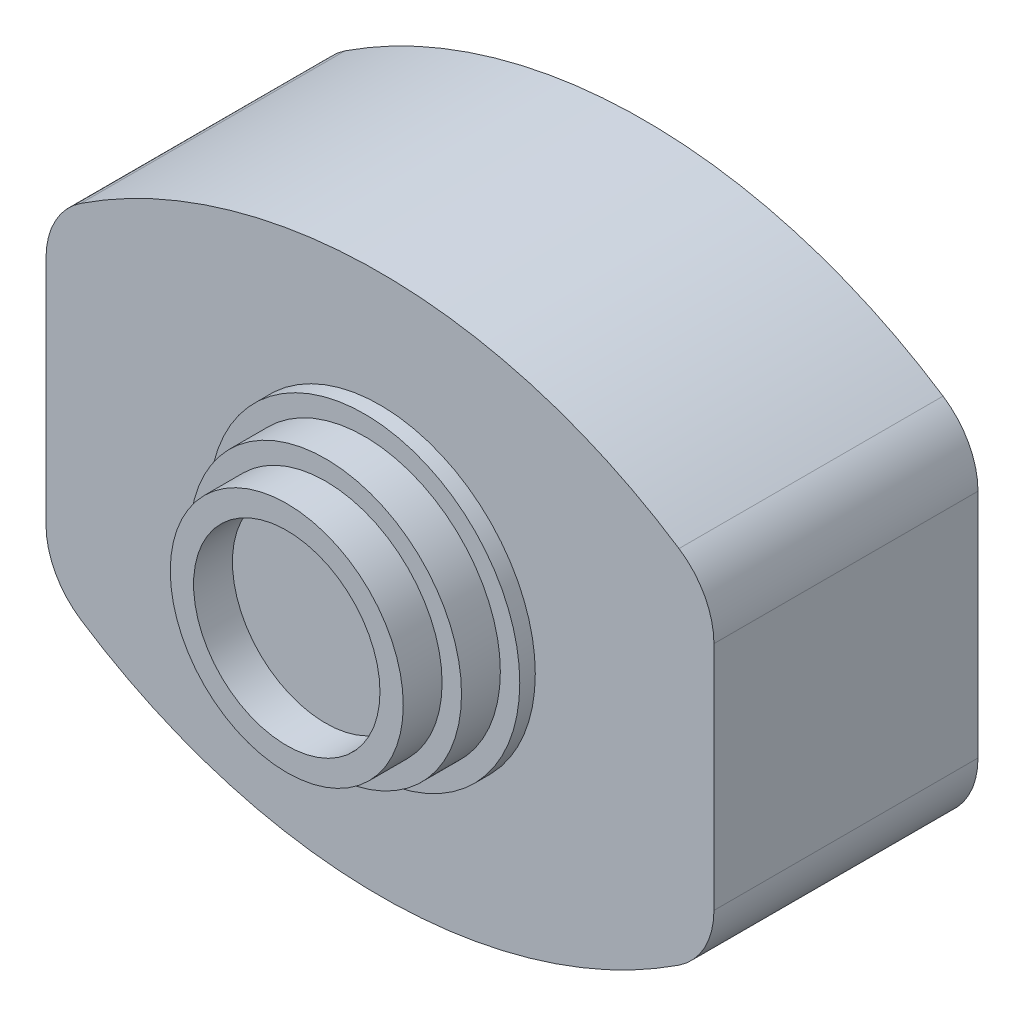
ISO-10303-21;
HEADER;
FILE_DESCRIPTION(('STEP AP214'),'2;1');
FILE_NAME('part.step','',(''),(''),'','','');
FILE_SCHEMA(('AUTOMOTIVE_DESIGN { 1 0 10303 214 1 1 1 1 }'));
ENDSEC;
DATA;
#1=APPLICATION_CONTEXT('core data for automotive mechanical design processes');
#2=APPLICATION_PROTOCOL_DEFINITION('international standard','automotive_design',2000,#1);
#3=PRODUCT_CONTEXT('',#1,'mechanical');
#4=PRODUCT('Part','Part','',(#3));
#5=PRODUCT_RELATED_PRODUCT_CATEGORY('part','',(#4));
#6=PRODUCT_DEFINITION_FORMATION('','',#4);
#7=PRODUCT_DEFINITION_CONTEXT('part definition',#1,'design');
#8=PRODUCT_DEFINITION('design','',#6,#7);
#9=PRODUCT_DEFINITION_SHAPE('','',#8);
#10=(LENGTH_UNIT() NAMED_UNIT(*) SI_UNIT(.MILLI.,.METRE.));
#11=(NAMED_UNIT(*) PLANE_ANGLE_UNIT() SI_UNIT($,.RADIAN.));
#12=(NAMED_UNIT(*) SI_UNIT($,.STERADIAN.) SOLID_ANGLE_UNIT());
#13=UNCERTAINTY_MEASURE_WITH_UNIT(LENGTH_MEASURE(1.E-05),#10,'distance_accuracy_value','');
#14=(GEOMETRIC_REPRESENTATION_CONTEXT(3) GLOBAL_UNCERTAINTY_ASSIGNED_CONTEXT((#13)) GLOBAL_UNIT_ASSIGNED_CONTEXT((#10,
#11,#12)) REPRESENTATION_CONTEXT('',''));
#15=CARTESIAN_POINT('',(0.,0.,0.));
#16=DIRECTION('',(0.,0.,1.));
#17=DIRECTION('',(1.,0.,0.));
#18=AXIS2_PLACEMENT_3D('',#15,#16,#17);
#19=CARTESIAN_POINT('',(0.,-9.76414208143409,0.));
#20=DIRECTION('',(0.,1.,0.));
#21=DIRECTION('',(0.,0.,1.));
#22=AXIS2_PLACEMENT_3D('',#19,#20,#21);
#23=PLANE('',#22);
#24=DIRECTION('',(-0.707106781186547,0.,0.707106781186547));
#25=VECTOR('',#24,1.);
#26=CARTESIAN_POINT('',(46.25,-9.76414208143409,20.65));
#27=LINE('',#26,#25);
#28=CARTESIAN_POINT('',(47.25,-9.76414208143409,19.65));
#29=VERTEX_POINT('',#28);
#30=CARTESIAN_POINT('',(46.25,-9.76414208143409,20.65));
#31=VERTEX_POINT('',#30);
#32=EDGE_CURVE('E181',#29,#31,#27,.T.);
#33=ORIENTED_EDGE('',*,*,#32,.T.);
#34=DIRECTION('',(-1.,0.,0.));
#35=VECTOR('',#34,1.);
#36=CARTESIAN_POINT('',(46.25,-9.76414208143409,20.65));
#37=LINE('',#36,#35);
#38=CARTESIAN_POINT('',(39.75,-9.76414208143409,20.65));
#39=VERTEX_POINT('',#38);
#40=EDGE_CURVE('E184',#31,#39,#37,.T.);
#41=ORIENTED_EDGE('',*,*,#40,.T.);
#42=DIRECTION('',(-0.707106781186547,0.,-0.707106781186547));
#43=VECTOR('',#42,1.);
#44=CARTESIAN_POINT('',(39.75,-9.76414208143409,20.65));
#45=LINE('',#44,#43);
#46=CARTESIAN_POINT('',(38.75,-9.76414208143409,19.65));
#47=VERTEX_POINT('',#46);
#48=EDGE_CURVE('E191',#39,#47,#45,.T.);
#49=ORIENTED_EDGE('',*,*,#48,.T.);
#50=DIRECTION('',(0.,0.,-1.));
#51=VECTOR('',#50,1.);
#52=CARTESIAN_POINT('',(38.75,-9.76414208143409,19.65));
#53=LINE('',#52,#51);
#54=CARTESIAN_POINT('',(38.75,-9.76414208143409,13.35));
#55=VERTEX_POINT('',#54);
#56=EDGE_CURVE('E194',#47,#55,#53,.T.);
#57=ORIENTED_EDGE('',*,*,#56,.T.);
#58=DIRECTION('',(1.,0.,0.));
#59=VECTOR('',#58,1.);
#60=CARTESIAN_POINT('',(38.75,-9.76414208143409,13.35));
#61=LINE('',#60,#59);
#62=CARTESIAN_POINT('',(47.25,-9.76414208143409,13.35));
#63=VERTEX_POINT('',#62);
#64=EDGE_CURVE('E197',#55,#63,#61,.T.);
#65=ORIENTED_EDGE('',*,*,#64,.T.);
#66=DIRECTION('',(0.,0.,1.));
#67=VECTOR('',#66,1.);
#68=CARTESIAN_POINT('',(47.25,-9.76414208143409,13.35));
#69=LINE('',#68,#67);
#70=EDGE_CURVE('E199',#63,#29,#69,.T.);
#71=ORIENTED_EDGE('',*,*,#70,.T.);
#72=EDGE_LOOP('',(#33,#41,#49,#57,#65,#71));
#73=FACE_BOUND('',#72,.T.);
#74=DIRECTION('',(0.,0.,1.));
#75=VECTOR('',#74,1.);
#76=CARTESIAN_POINT('',(44.9778676882779,-9.76414208143409,18.7737837682118));
#77=LINE('',#76,#75);
#78=CARTESIAN_POINT('',(44.9778676882779,-9.76414208143409,15.2262162317882));
#79=VERTEX_POINT('',#78);
#80=CARTESIAN_POINT('',(44.9778676882779,-9.76414208143409,18.7737837682118));
#81=VERTEX_POINT('',#80);
#82=EDGE_CURVE('E180',#79,#81,#77,.T.);
#83=ORIENTED_EDGE('',*,*,#82,.F.);
#84=DIRECTION('',(1.,0.,0.));
#85=VECTOR('',#84,1.);
#86=CARTESIAN_POINT('',(41.022132311722,-9.76414208143409,15.2262162317882));
#87=LINE('',#86,#85);
#88=CARTESIAN_POINT('',(41.022132311722,-9.76414208143409,15.2262162317882));
#89=VERTEX_POINT('',#88);
#90=EDGE_CURVE('E177',#89,#79,#87,.T.);
#91=ORIENTED_EDGE('',*,*,#90,.F.);
#92=DIRECTION('',(0.,0.,-1.));
#93=VECTOR('',#92,1.);
#94=CARTESIAN_POINT('',(41.022132311722,-9.76414208143409,18.7737837682118));
#95=LINE('',#94,#93);
#96=CARTESIAN_POINT('',(41.022132311722,-9.76414208143409,18.7737837682118));
#97=VERTEX_POINT('',#96);
#98=EDGE_CURVE('E55',#97,#89,#95,.T.);
#99=ORIENTED_EDGE('',*,*,#98,.F.);
#100=DIRECTION('',(-1.,0.,0.));
#101=VECTOR('',#100,1.);
#102=CARTESIAN_POINT('',(41.022132311722,-9.76414208143409,18.7737837682118));
#103=LINE('',#102,#101);
#104=EDGE_CURVE('E50',#81,#97,#103,.T.);
#105=ORIENTED_EDGE('',*,*,#104,.F.);
#106=EDGE_LOOP('',(#83,#91,#99,#105));
#107=FACE_BOUND('',#106,.T.);
#108=ADVANCED_FACE('F35',(#73,#107),#23,.F.);
#109=CARTESIAN_POINT('',(76.,5.12597865309571,34.));
#110=DIRECTION('',(0.,0.,-1.));
#111=DIRECTION('',(-1.,0.,0.));
#112=AXIS2_PLACEMENT_3D('',#109,#110,#111);
#113=CYLINDRICAL_SURFACE('',#112,9.99999999999999);
#114=CARTESIAN_POINT('',(76.,5.12597865309571,0.));
#115=DIRECTION('',(0.,0.,1.));
#116=DIRECTION('',(1.,0.,0.));
#117=AXIS2_PLACEMENT_3D('',#114,#115,#116);
#118=CIRCLE('',#117,9.99999999999999);
#119=CARTESIAN_POINT('',(81.5,-3.22566789114932,0.));
#120=VERTEX_POINT('',#119);
#121=CARTESIAN_POINT('',(86.,5.12597865309571,0.));
#122=VERTEX_POINT('',#121);
#123=EDGE_CURVE('E242',#120,#122,#118,.T.);
#124=ORIENTED_EDGE('',*,*,#123,.T.);
#125=DIRECTION('',(0.,0.,-1.));
#126=VECTOR('',#125,1.);
#127=CARTESIAN_POINT('',(86.,5.12597865309571,34.));
#128=LINE('',#127,#126);
#129=CARTESIAN_POINT('',(86.,5.12597865309571,34.));
#130=VERTEX_POINT('',#129);
#131=EDGE_CURVE('E245',#130,#122,#128,.T.);
#132=ORIENTED_EDGE('',*,*,#131,.F.);
#133=CARTESIAN_POINT('',(76.,5.12597865309571,34.));
#134=DIRECTION('',(0.,0.,1.));
#135=DIRECTION('',(1.,0.,0.));
#136=AXIS2_PLACEMENT_3D('',#133,#134,#135);
#137=CIRCLE('',#136,9.99999999999999);
#138=CARTESIAN_POINT('',(81.5,-3.22566789114932,34.));
#139=VERTEX_POINT('',#138);
#140=EDGE_CURVE('E246',#139,#130,#137,.T.);
#141=ORIENTED_EDGE('',*,*,#140,.F.);
#142=DIRECTION('',(0.,0.,-1.));
#143=VECTOR('',#142,1.);
#144=CARTESIAN_POINT('',(81.5,-3.22566789114932,34.));
#145=LINE('',#144,#143);
#146=EDGE_CURVE('E264',#139,#120,#145,.T.);
#147=ORIENTED_EDGE('',*,*,#146,.T.);
#148=EDGE_LOOP('',(#124,#132,#141,#147));
#149=FACE_BOUND('',#148,.T.);
#150=ADVANCED_FACE('F37',(#149),#113,.T.);
#151=CARTESIAN_POINT('',(86.,5.12597865309571,34.));
#152=DIRECTION('',(-1.,0.,0.));
#153=DIRECTION('',(0.,0.,1.));
#154=AXIS2_PLACEMENT_3D('',#151,#152,#153);
#155=PLANE('',#154);
#156=DIRECTION('',(0.,1.,0.));
#157=VECTOR('',#156,1.);
#158=CARTESIAN_POINT('',(86.,5.12597865309571,0.));
#159=LINE('',#158,#157);
#160=CARTESIAN_POINT('',(86.,34.8740213469043,0.));
#161=VERTEX_POINT('',#160);
#162=EDGE_CURVE('E267',#122,#161,#159,.T.);
#163=ORIENTED_EDGE('',*,*,#162,.T.);
#164=DIRECTION('',(0.,0.,-1.));
#165=VECTOR('',#164,1.);
#166=CARTESIAN_POINT('',(86.,34.8740213469043,34.));
#167=LINE('',#166,#165);
#168=CARTESIAN_POINT('',(86.,34.8740213469043,34.));
#169=VERTEX_POINT('',#168);
#170=EDGE_CURVE('E297',#169,#161,#167,.T.);
#171=ORIENTED_EDGE('',*,*,#170,.F.);
#172=DIRECTION('',(0.,1.,0.));
#173=VECTOR('',#172,1.);
#174=CARTESIAN_POINT('',(86.,5.12597865309571,34.));
#175=LINE('',#174,#173);
#176=EDGE_CURVE('E249',#130,#169,#175,.T.);
#177=ORIENTED_EDGE('',*,*,#176,.F.);
#178=ORIENTED_EDGE('',*,*,#131,.T.);
#179=EDGE_LOOP('',(#163,#171,#177,#178));
#180=FACE_BOUND('',#179,.T.);
#181=ADVANCED_FACE('F352',(#180),#155,.F.);
#182=CARTESIAN_POINT('',(76.,34.8740213469043,34.));
#183=DIRECTION('',(0.,0.,-1.));
#184=DIRECTION('',(-1.,0.,0.));
#185=AXIS2_PLACEMENT_3D('',#182,#183,#184);
#186=CYLINDRICAL_SURFACE('',#185,9.99999999999999);
#187=CARTESIAN_POINT('',(76.,34.8740213469043,0.));
#188=DIRECTION('',(0.,0.,1.));
#189=DIRECTION('',(1.,0.,0.));
#190=AXIS2_PLACEMENT_3D('',#187,#188,#189);
#191=CIRCLE('',#190,9.99999999999999);
#192=CARTESIAN_POINT('',(81.5,43.2256678911493,0.));
#193=VERTEX_POINT('',#192);
#194=EDGE_CURVE('E269',#161,#193,#191,.T.);
#195=ORIENTED_EDGE('',*,*,#194,.T.);
#196=DIRECTION('',(0.,0.,-1.));
#197=VECTOR('',#196,1.);
#198=CARTESIAN_POINT('',(81.5,43.2256678911493,34.));
#199=LINE('',#198,#197);
#200=CARTESIAN_POINT('',(81.5,43.2256678911493,34.));
#201=VERTEX_POINT('',#200);
#202=EDGE_CURVE('E294',#201,#193,#199,.T.);
#203=ORIENTED_EDGE('',*,*,#202,.F.);
#204=CARTESIAN_POINT('',(76.,34.8740213469043,34.));
#205=DIRECTION('',(0.,0.,1.));
#206=DIRECTION('',(1.,0.,0.));
#207=AXIS2_PLACEMENT_3D('',#204,#205,#206);
#208=CIRCLE('',#207,9.99999999999999);
#209=EDGE_CURVE('E252',#169,#201,#208,.T.);
#210=ORIENTED_EDGE('',*,*,#209,.F.);
#211=ORIENTED_EDGE('',*,*,#170,.T.);
#212=EDGE_LOOP('',(#195,#203,#210,#211));
#213=FACE_BOUND('',#212,.T.);
#214=ADVANCED_FACE('F570',(#213),#186,.T.);
#215=CARTESIAN_POINT('',(43.,-15.2358579185659,34.));
#216=DIRECTION('',(0.,0.,-1.));
#217=DIRECTION('',(-1.,0.,0.));
#218=AXIS2_PLACEMENT_3D('',#215,#216,#217);
#219=CYLINDRICAL_SURFACE('',#218,70.);
#220=CARTESIAN_POINT('',(43.,-15.2358579185659,0.));
#221=DIRECTION('',(0.,0.,1.));
#222=DIRECTION('',(-1.,0.,0.));
#223=AXIS2_PLACEMENT_3D('',#220,#221,#222);
#224=CIRCLE('',#223,70.);
#225=CARTESIAN_POINT('',(4.5,43.2256678911493,0.));
#226=VERTEX_POINT('',#225);
#227=EDGE_CURVE('E271',#193,#226,#224,.T.);
#228=ORIENTED_EDGE('',*,*,#227,.T.);
#229=DIRECTION('',(0.,0.,-1.));
#230=VECTOR('',#229,1.);
#231=CARTESIAN_POINT('',(4.5,43.2256678911493,34.));
#232=LINE('',#231,#230);
#233=CARTESIAN_POINT('',(4.5,43.2256678911493,34.));
#234=VERTEX_POINT('',#233);
#235=EDGE_CURVE('E291',#234,#226,#232,.T.);
#236=ORIENTED_EDGE('',*,*,#235,.F.);
#237=CARTESIAN_POINT('',(43.,-15.2358579185659,34.));
#238=DIRECTION('',(0.,0.,1.));
#239=DIRECTION('',(-1.,0.,0.));
#240=AXIS2_PLACEMENT_3D('',#237,#238,#239);
#241=CIRCLE('',#240,70.);
#242=EDGE_CURVE('E254',#201,#234,#241,.T.);
#243=ORIENTED_EDGE('',*,*,#242,.F.);
#244=ORIENTED_EDGE('',*,*,#202,.T.);
#245=EDGE_LOOP('',(#228,#236,#243,#244));
#246=FACE_BOUND('',#245,.T.);
#247=ADVANCED_FACE('F551',(#246),#219,.T.);
#248=CARTESIAN_POINT('',(10.,34.8740213469043,34.));
#249=DIRECTION('',(0.,0.,-1.));
#250=DIRECTION('',(-1.,0.,0.));
#251=AXIS2_PLACEMENT_3D('',#248,#249,#250);
#252=CYLINDRICAL_SURFACE('',#251,10.);
#253=CARTESIAN_POINT('',(10.,34.8740213469043,0.));
#254=DIRECTION('',(0.,0.,1.));
#255=DIRECTION('',(1.,0.,0.));
#256=AXIS2_PLACEMENT_3D('',#253,#254,#255);
#257=CIRCLE('',#256,10.);
#258=CARTESIAN_POINT('',(0.,34.8740213469043,0.));
#259=VERTEX_POINT('',#258);
#260=EDGE_CURVE('E273',#226,#259,#257,.T.);
#261=ORIENTED_EDGE('',*,*,#260,.T.);
#262=DIRECTION('',(0.,0.,-1.));
#263=VECTOR('',#262,1.);
#264=CARTESIAN_POINT('',(0.,34.8740213469043,34.));
#265=LINE('',#264,#263);
#266=CARTESIAN_POINT('',(0.,34.8740213469043,34.));
#267=VERTEX_POINT('',#266);
#268=EDGE_CURVE('E288',#267,#259,#265,.T.);
#269=ORIENTED_EDGE('',*,*,#268,.F.);
#270=CARTESIAN_POINT('',(10.,34.8740213469043,34.));
#271=DIRECTION('',(0.,0.,1.));
#272=DIRECTION('',(1.,0.,0.));
#273=AXIS2_PLACEMENT_3D('',#270,#271,#272);
#274=CIRCLE('',#273,10.);
#275=EDGE_CURVE('E256',#234,#267,#274,.T.);
#276=ORIENTED_EDGE('',*,*,#275,.F.);
#277=ORIENTED_EDGE('',*,*,#235,.T.);
#278=EDGE_LOOP('',(#261,#269,#276,#277));
#279=FACE_BOUND('',#278,.T.);
#280=ADVANCED_FACE('F541',(#279),#252,.T.);
#281=CARTESIAN_POINT('',(0.,34.8740213469043,34.));
#282=DIRECTION('',(1.,0.,0.));
#283=DIRECTION('',(0.,0.,-1.));
#284=AXIS2_PLACEMENT_3D('',#281,#282,#283);
#285=PLANE('',#284);
#286=DIRECTION('',(0.,-1.,0.));
#287=VECTOR('',#286,1.);
#288=CARTESIAN_POINT('',(0.,34.8740213469043,0.));
#289=LINE('',#288,#287);
#290=CARTESIAN_POINT('',(0.,5.12597865309571,0.));
#291=VERTEX_POINT('',#290);
#292=EDGE_CURVE('E275',#259,#291,#289,.T.);
#293=ORIENTED_EDGE('',*,*,#292,.T.);
#294=DIRECTION('',(0.,0.,-1.));
#295=VECTOR('',#294,1.);
#296=CARTESIAN_POINT('',(0.,5.12597865309571,34.));
#297=LINE('',#296,#295);
#298=CARTESIAN_POINT('',(0.,5.12597865309571,34.));
#299=VERTEX_POINT('',#298);
#300=EDGE_CURVE('E285',#299,#291,#297,.T.);
#301=ORIENTED_EDGE('',*,*,#300,.F.);
#302=DIRECTION('',(0.,-1.,0.));
#303=VECTOR('',#302,1.);
#304=CARTESIAN_POINT('',(0.,34.8740213469043,34.));
#305=LINE('',#304,#303);
#306=EDGE_CURVE('E258',#267,#299,#305,.T.);
#307=ORIENTED_EDGE('',*,*,#306,.F.);
#308=ORIENTED_EDGE('',*,*,#268,.T.);
#309=EDGE_LOOP('',(#293,#301,#307,#308));
#310=FACE_BOUND('',#309,.T.);
#311=ADVANCED_FACE('F529',(#310),#285,.F.);
#312=CARTESIAN_POINT('',(10.,5.12597865309571,34.));
#313=DIRECTION('',(0.,0.,-1.));
#314=DIRECTION('',(-1.,0.,0.));
#315=AXIS2_PLACEMENT_3D('',#312,#313,#314);
#316=CYLINDRICAL_SURFACE('',#315,10.);
#317=CARTESIAN_POINT('',(10.,5.12597865309571,0.));
#318=DIRECTION('',(0.,0.,1.));
#319=DIRECTION('',(-1.,0.,0.));
#320=AXIS2_PLACEMENT_3D('',#317,#318,#319);
#321=CIRCLE('',#320,10.);
#322=CARTESIAN_POINT('',(4.49999999999998,-3.22566789114931,0.));
#323=VERTEX_POINT('',#322);
#324=EDGE_CURVE('E277',#291,#323,#321,.T.);
#325=ORIENTED_EDGE('',*,*,#324,.T.);
#326=DIRECTION('',(0.,0.,-1.));
#327=VECTOR('',#326,1.);
#328=CARTESIAN_POINT('',(4.49999999999998,-3.22566789114931,34.));
#329=LINE('',#328,#327);
#330=CARTESIAN_POINT('',(4.49999999999998,-3.22566789114931,34.));
#331=VERTEX_POINT('',#330);
#332=EDGE_CURVE('E282',#331,#323,#329,.T.);
#333=ORIENTED_EDGE('',*,*,#332,.F.);
#334=CARTESIAN_POINT('',(10.,5.12597865309571,34.));
#335=DIRECTION('',(0.,0.,1.));
#336=DIRECTION('',(-1.,0.,0.));
#337=AXIS2_PLACEMENT_3D('',#334,#335,#336);
#338=CIRCLE('',#337,10.);
#339=EDGE_CURVE('E260',#299,#331,#338,.T.);
#340=ORIENTED_EDGE('',*,*,#339,.F.);
#341=ORIENTED_EDGE('',*,*,#300,.T.);
#342=EDGE_LOOP('',(#325,#333,#340,#341));
#343=FACE_BOUND('',#342,.T.);
#344=ADVANCED_FACE('F524',(#343),#316,.T.);
#345=CARTESIAN_POINT('',(43.,55.2358579185659,34.));
#346=DIRECTION('',(0.,0.,-1.));
#347=DIRECTION('',(-1.,0.,0.));
#348=AXIS2_PLACEMENT_3D('',#345,#346,#347);
#349=CYLINDRICAL_SURFACE('',#348,70.);
#350=CARTESIAN_POINT('',(43.,55.2358579185659,23.9));
#351=DIRECTION('',(-0.707106781186548,0.,0.707106781186548));
#352=DIRECTION('',(-0.707106781186548,0.,-0.707106781186548));
#353=AXIS2_PLACEMENT_3D('',#350,#351,#352);
#354=ELLIPSE('',#353,98.9949493661166,70.);
#355=CARTESIAN_POINT('',(38.75,-14.635005107448,19.65));
#356=VERTEX_POINT('',#355);
#357=CARTESIAN_POINT('',(39.75,-14.6886549506704,20.65));
#358=VERTEX_POINT('',#357);
#359=EDGE_CURVE('E11',#356,#358,#354,.T.);
#360=ORIENTED_EDGE('',*,*,#359,.T.);
#361=CARTESIAN_POINT('',(43.,55.2358579185659,20.65));
#362=DIRECTION('',(0.,0.,1.));
#363=DIRECTION('',(1.,0.,0.));
#364=AXIS2_PLACEMENT_3D('',#361,#362,#363);
#365=CIRCLE('',#364,70.);
#366=CARTESIAN_POINT('',(46.25,-14.6886549506704,20.65));
#367=VERTEX_POINT('',#366);
#368=EDGE_CURVE('E232',#358,#367,#365,.T.);
#369=ORIENTED_EDGE('',*,*,#368,.T.);
#370=CARTESIAN_POINT('',(43.,55.2358579185659,23.9));
#371=DIRECTION('',(0.707106781186548,0.,0.707106781186548));
#372=DIRECTION('',(0.707106781186548,0.,-0.707106781186548));
#373=AXIS2_PLACEMENT_3D('',#370,#371,#372);
#374=ELLIPSE('',#373,98.9949493661166,70.);
#375=CARTESIAN_POINT('',(47.25,-14.635005107448,19.65));
#376=VERTEX_POINT('',#375);
#377=EDGE_CURVE('E307',#367,#376,#374,.T.);
#378=ORIENTED_EDGE('',*,*,#377,.T.);
#379=DIRECTION('',(0.,0.,-1.));
#380=VECTOR('',#379,1.);
#381=CARTESIAN_POINT('',(47.25,-14.635005107448,34.));
#382=LINE('',#381,#380);
#383=CARTESIAN_POINT('',(47.25,-14.635005107448,13.35));
#384=VERTEX_POINT('',#383);
#385=EDGE_CURVE('E43',#376,#384,#382,.T.);
#386=ORIENTED_EDGE('',*,*,#385,.T.);
#387=CARTESIAN_POINT('',(43.,55.2358579185659,13.35));
#388=DIRECTION('',(0.,0.,-1.));
#389=DIRECTION('',(-1.,0.,0.));
#390=AXIS2_PLACEMENT_3D('',#387,#388,#389);
#391=CIRCLE('',#390,70.);
#392=CARTESIAN_POINT('',(38.75,-14.635005107448,13.35));
#393=VERTEX_POINT('',#392);
#394=EDGE_CURVE('E304',#384,#393,#391,.T.);
#395=ORIENTED_EDGE('',*,*,#394,.T.);
#396=DIRECTION('',(0.,0.,-1.));
#397=VECTOR('',#396,1.);
#398=CARTESIAN_POINT('',(38.75,-14.635005107448,34.));
#399=LINE('',#398,#397);
#400=EDGE_CURVE('E310',#393,#356,#399,.F.);
#401=ORIENTED_EDGE('',*,*,#400,.T.);
#402=EDGE_LOOP('',(#360,#369,#378,#386,#395,#401));
#403=FACE_BOUND('',#402,.T.);
#404=CARTESIAN_POINT('',(43.,55.2358579185659,0.));
#405=DIRECTION('',(0.,0.,1.));
#406=DIRECTION('',(1.,0.,0.));
#407=AXIS2_PLACEMENT_3D('',#404,#405,#406);
#408=CIRCLE('',#407,70.);
#409=EDGE_CURVE('E250',#323,#120,#408,.T.);
#410=ORIENTED_EDGE('',*,*,#409,.T.);
#411=ORIENTED_EDGE('',*,*,#146,.F.);
#412=CARTESIAN_POINT('',(43.,55.2358579185659,34.));
#413=DIRECTION('',(0.,0.,1.));
#414=DIRECTION('',(1.,0.,0.));
#415=AXIS2_PLACEMENT_3D('',#412,#413,#414);
#416=CIRCLE('',#415,70.);
#417=EDGE_CURVE('E262',#331,#139,#416,.T.);
#418=ORIENTED_EDGE('',*,*,#417,.F.);
#419=ORIENTED_EDGE('',*,*,#332,.T.);
#420=EDGE_LOOP('',(#410,#411,#418,#419));
#421=FACE_BOUND('',#420,.T.);
#422=ADVANCED_FACE('F314',(#403,#421),#349,.T.);
#423=CARTESIAN_POINT('',(76.,5.12597865309571,34.));
#424=DIRECTION('',(0.,0.,1.));
#425=DIRECTION('',(1.,0.,0.));
#426=AXIS2_PLACEMENT_3D('',#423,#424,#425);
#427=PLANE('',#426);
#428=CARTESIAN_POINT('',(43.,20.,34.));
#429=DIRECTION('',(0.,0.,1.));
#430=DIRECTION('',(1.,0.,0.));
#431=AXIS2_PLACEMENT_3D('',#428,#429,#430);
#432=CIRCLE('',#431,20.);
#433=CARTESIAN_POINT('',(63.,20.,34.));
#434=VERTEX_POINT('',#433);
#435=EDGE_CURVE('E239',#434,#434,#432,.T.);
#436=ORIENTED_EDGE('',*,*,#435,.F.);
#437=EDGE_LOOP('',(#436));
#438=FACE_BOUND('',#437,.T.);
#439=ORIENTED_EDGE('',*,*,#140,.T.);
#440=ORIENTED_EDGE('',*,*,#176,.T.);
#441=ORIENTED_EDGE('',*,*,#209,.T.);
#442=ORIENTED_EDGE('',*,*,#242,.T.);
#443=ORIENTED_EDGE('',*,*,#275,.T.);
#444=ORIENTED_EDGE('',*,*,#306,.T.);
#445=ORIENTED_EDGE('',*,*,#339,.T.);
#446=ORIENTED_EDGE('',*,*,#417,.T.);
#447=EDGE_LOOP('',(#439,#440,#441,#442,#443,#444,#445,#446));
#448=FACE_BOUND('',#447,.T.);
#449=ADVANCED_FACE('F561',(#438,#448),#427,.T.);
#450=CARTESIAN_POINT('',(76.,5.12597865309571,0.));
#451=DIRECTION('',(0.,0.,1.));
#452=DIRECTION('',(1.,0.,0.));
#453=AXIS2_PLACEMENT_3D('',#450,#451,#452);
#454=PLANE('',#453);
#455=ORIENTED_EDGE('',*,*,#123,.F.);
#456=ORIENTED_EDGE('',*,*,#409,.F.);
#457=ORIENTED_EDGE('',*,*,#324,.F.);
#458=ORIENTED_EDGE('',*,*,#292,.F.);
#459=ORIENTED_EDGE('',*,*,#260,.F.);
#460=ORIENTED_EDGE('',*,*,#227,.F.);
#461=ORIENTED_EDGE('',*,*,#194,.F.);
#462=ORIENTED_EDGE('',*,*,#162,.F.);
#463=EDGE_LOOP('',(#455,#456,#457,#458,#459,#460,#461,#462));
#464=FACE_BOUND('',#463,.T.);
#465=ADVANCED_FACE('F516',(#464),#454,.F.);
#466=CARTESIAN_POINT('',(43.,20.,36.));
#467=DIRECTION('',(0.,0.,-1.));
#468=DIRECTION('',(-1.,0.,0.));
#469=AXIS2_PLACEMENT_3D('',#466,#467,#468);
#470=CYLINDRICAL_SURFACE('',#469,20.);
#471=CARTESIAN_POINT('',(43.,20.,36.));
#472=DIRECTION('',(0.,0.,1.));
#473=DIRECTION('',(1.,0.,0.));
#474=AXIS2_PLACEMENT_3D('',#471,#472,#473);
#475=CIRCLE('',#474,20.);
#476=CARTESIAN_POINT('',(63.,20.,36.));
#477=VERTEX_POINT('',#476);
#478=EDGE_CURVE('E236',#477,#477,#475,.T.);
#479=ORIENTED_EDGE('',*,*,#478,.F.);
#480=EDGE_LOOP('',(#479));
#481=FACE_BOUND('',#480,.T.);
#482=ORIENTED_EDGE('',*,*,#435,.T.);
#483=EDGE_LOOP('',(#482));
#484=FACE_BOUND('',#483,.T.);
#485=ADVANCED_FACE('F506',(#481,#484),#470,.T.);
#486=CARTESIAN_POINT('',(43.,20.,36.));
#487=DIRECTION('',(0.,0.,1.));
#488=DIRECTION('',(1.,0.,0.));
#489=AXIS2_PLACEMENT_3D('',#486,#487,#488);
#490=PLANE('',#489);
#491=CARTESIAN_POINT('',(43.,20.,36.));
#492=DIRECTION('',(0.,0.,1.));
#493=DIRECTION('',(1.,0.,0.));
#494=AXIS2_PLACEMENT_3D('',#491,#492,#493);
#495=CIRCLE('',#494,17.5);
#496=CARTESIAN_POINT('',(60.5,20.,36.));
#497=VERTEX_POINT('',#496);
#498=EDGE_CURVE('E233',#497,#497,#495,.T.);
#499=ORIENTED_EDGE('',*,*,#498,.F.);
#500=EDGE_LOOP('',(#499));
#501=FACE_BOUND('',#500,.T.);
#502=ORIENTED_EDGE('',*,*,#478,.T.);
#503=EDGE_LOOP('',(#502));
#504=FACE_BOUND('',#503,.T.);
#505=ADVANCED_FACE('F496',(#501,#504),#490,.T.);
#506=CARTESIAN_POINT('',(43.,20.,41.));
#507=DIRECTION('',(0.,0.,-1.));
#508=DIRECTION('',(-1.,0.,0.));
#509=AXIS2_PLACEMENT_3D('',#506,#507,#508);
#510=CYLINDRICAL_SURFACE('',#509,17.5);
#511=CARTESIAN_POINT('',(43.,20.,41.));
#512=DIRECTION('',(0.,0.,1.));
#513=DIRECTION('',(1.,0.,0.));
#514=AXIS2_PLACEMENT_3D('',#511,#512,#513);
#515=CIRCLE('',#514,17.5);
#516=CARTESIAN_POINT('',(60.5,20.,41.));
#517=VERTEX_POINT('',#516);
#518=EDGE_CURVE('E228',#517,#517,#515,.T.);
#519=ORIENTED_EDGE('',*,*,#518,.F.);
#520=EDGE_LOOP('',(#519));
#521=FACE_BOUND('',#520,.T.);
#522=ORIENTED_EDGE('',*,*,#498,.T.);
#523=EDGE_LOOP('',(#522));
#524=FACE_BOUND('',#523,.T.);
#525=ADVANCED_FACE('F486',(#521,#524),#510,.T.);
#526=CARTESIAN_POINT('',(43.,20.,41.));
#527=DIRECTION('',(0.,0.,1.));
#528=DIRECTION('',(1.,0.,0.));
#529=AXIS2_PLACEMENT_3D('',#526,#527,#528);
#530=PLANE('',#529);
#531=CARTESIAN_POINT('',(43.,20.,41.));
#532=DIRECTION('',(0.,0.,1.));
#533=DIRECTION('',(1.,0.,0.));
#534=AXIS2_PLACEMENT_3D('',#531,#532,#533);
#535=CIRCLE('',#534,15.);
#536=CARTESIAN_POINT('',(58.,20.,41.));
#537=VERTEX_POINT('',#536);
#538=EDGE_CURVE('E229',#537,#537,#535,.T.);
#539=ORIENTED_EDGE('',*,*,#538,.F.);
#540=EDGE_LOOP('',(#539));
#541=FACE_BOUND('',#540,.T.);
#542=ORIENTED_EDGE('',*,*,#518,.T.);
#543=EDGE_LOOP('',(#542));
#544=FACE_BOUND('',#543,.T.);
#545=ADVANCED_FACE('F476',(#541,#544),#530,.T.);
#546=CARTESIAN_POINT('',(43.,20.,46.));
#547=DIRECTION('',(0.,0.,-1.));
#548=DIRECTION('',(-1.,0.,0.));
#549=AXIS2_PLACEMENT_3D('',#546,#547,#548);
#550=CYLINDRICAL_SURFACE('',#549,15.);
#551=CARTESIAN_POINT('',(43.,20.,46.));
#552=DIRECTION('',(0.,0.,1.));
#553=DIRECTION('',(1.,0.,0.));
#554=AXIS2_PLACEMENT_3D('',#551,#552,#553);
#555=CIRCLE('',#554,15.);
#556=CARTESIAN_POINT('',(58.,20.,46.));
#557=VERTEX_POINT('',#556);
#558=EDGE_CURVE('E223',#557,#557,#555,.T.);
#559=ORIENTED_EDGE('',*,*,#558,.F.);
#560=EDGE_LOOP('',(#559));
#561=FACE_BOUND('',#560,.T.);
#562=ORIENTED_EDGE('',*,*,#538,.T.);
#563=EDGE_LOOP('',(#562));
#564=FACE_BOUND('',#563,.T.);
#565=ADVANCED_FACE('F466',(#561,#564),#550,.T.);
#566=CARTESIAN_POINT('',(43.,20.,46.));
#567=DIRECTION('',(0.,0.,1.));
#568=DIRECTION('',(1.,0.,0.));
#569=AXIS2_PLACEMENT_3D('',#566,#567,#568);
#570=PLANE('',#569);
#571=CARTESIAN_POINT('',(43.,20.,46.));
#572=DIRECTION('',(0.,0.,1.));
#573=DIRECTION('',(1.,0.,0.));
#574=AXIS2_PLACEMENT_3D('',#571,#572,#573);
#575=CIRCLE('',#574,12.);
#576=CARTESIAN_POINT('',(55.,20.,46.));
#577=VERTEX_POINT('',#576);
#578=EDGE_CURVE('E206',#577,#577,#575,.T.);
#579=ORIENTED_EDGE('',*,*,#578,.F.);
#580=EDGE_LOOP('',(#579));
#581=FACE_BOUND('',#580,.T.);
#582=ORIENTED_EDGE('',*,*,#558,.T.);
#583=EDGE_LOOP('',(#582));
#584=FACE_BOUND('',#583,.T.);
#585=ADVANCED_FACE('F456',(#581,#584),#570,.T.);
#586=CARTESIAN_POINT('',(43.,20.,41.));
#587=DIRECTION('',(0.,0.,1.));
#588=DIRECTION('',(1.,0.,0.));
#589=AXIS2_PLACEMENT_3D('',#586,#587,#588);
#590=CYLINDRICAL_SURFACE('',#589,12.);
#591=CARTESIAN_POINT('',(43.,20.,41.));
#592=DIRECTION('',(0.,0.,1.));
#593=DIRECTION('',(1.,0.,0.));
#594=AXIS2_PLACEMENT_3D('',#591,#592,#593);
#595=CIRCLE('',#594,12.);
#596=CARTESIAN_POINT('',(55.,20.,41.));
#597=VERTEX_POINT('',#596);
#598=EDGE_CURVE('E220',#597,#597,#595,.T.);
#599=ORIENTED_EDGE('',*,*,#598,.F.);
#600=EDGE_LOOP('',(#599));
#601=FACE_BOUND('',#600,.T.);
#602=ORIENTED_EDGE('',*,*,#578,.T.);
#603=EDGE_LOOP('',(#602));
#604=FACE_BOUND('',#603,.T.);
#605=ADVANCED_FACE('F444',(#601,#604),#590,.F.);
#606=CARTESIAN_POINT('',(43.,20.,41.));
#607=DIRECTION('',(0.,0.,1.));
#608=DIRECTION('',(1.,0.,0.));
#609=AXIS2_PLACEMENT_3D('',#606,#607,#608);
#610=PLANE('',#609);
#611=ORIENTED_EDGE('',*,*,#598,.T.);
#612=EDGE_LOOP('',(#611));
#613=FACE_BOUND('',#612,.T.);
#614=ADVANCED_FACE('F439',(#613),#610,.T.);
#615=CARTESIAN_POINT('',(46.25,-9.76414208143409,20.65));
#616=DIRECTION('',(0.707106781186548,0.,0.707106781186548));
#617=DIRECTION('',(0.707106781186548,0.,-0.707106781186548));
#618=AXIS2_PLACEMENT_3D('',#615,#616,#617);
#619=PLANE('',#618);
#620=DIRECTION('',(0.,-1.,0.));
#621=VECTOR('',#620,1.);
#622=CARTESIAN_POINT('',(46.25,-9.76414208143409,20.65));
#623=LINE('',#622,#621);
#624=EDGE_CURVE('E202',#31,#367,#623,.T.);
#625=ORIENTED_EDGE('',*,*,#624,.F.);
#626=ORIENTED_EDGE('',*,*,#32,.F.);
#627=DIRECTION('',(0.,-1.,0.));
#628=VECTOR('',#627,1.);
#629=CARTESIAN_POINT('',(47.25,-9.76414208143409,19.65));
#630=LINE('',#629,#628);
#631=EDGE_CURVE('E203',#29,#376,#630,.T.);
#632=ORIENTED_EDGE('',*,*,#631,.T.);
#633=ORIENTED_EDGE('',*,*,#377,.F.);
#634=EDGE_LOOP('',(#625,#626,#632,#633));
#635=FACE_BOUND('',#634,.T.);
#636=ADVANCED_FACE('F323',(#635),#619,.F.);
#637=CARTESIAN_POINT('',(47.25,-9.76414208143409,13.35));
#638=DIRECTION('',(1.,0.,0.));
#639=DIRECTION('',(0.,0.,-1.));
#640=AXIS2_PLACEMENT_3D('',#637,#638,#639);
#641=PLANE('',#640);
#642=ORIENTED_EDGE('',*,*,#631,.F.);
#643=ORIENTED_EDGE('',*,*,#70,.F.);
#644=DIRECTION('',(0.,-1.,0.));
#645=VECTOR('',#644,1.);
#646=CARTESIAN_POINT('',(47.25,-9.76414208143409,13.35));
#647=LINE('',#646,#645);
#648=EDGE_CURVE('E207',#63,#384,#647,.T.);
#649=ORIENTED_EDGE('',*,*,#648,.T.);
#650=ORIENTED_EDGE('',*,*,#385,.F.);
#651=EDGE_LOOP('',(#642,#643,#649,#650));
#652=FACE_BOUND('',#651,.T.);
#653=ADVANCED_FACE('F318',(#652),#641,.F.);
#654=CARTESIAN_POINT('',(43.,-9.76414208143409,13.35));
#655=DIRECTION('',(0.,0.,-1.));
#656=DIRECTION('',(-1.,0.,0.));
#657=AXIS2_PLACEMENT_3D('',#654,#655,#656);
#658=PLANE('',#657);
#659=ORIENTED_EDGE('',*,*,#648,.F.);
#660=ORIENTED_EDGE('',*,*,#64,.F.);
#661=DIRECTION('',(0.,-1.,0.));
#662=VECTOR('',#661,1.);
#663=CARTESIAN_POINT('',(38.75,-9.76414208143409,13.35));
#664=LINE('',#663,#662);
#665=EDGE_CURVE('E210',#55,#393,#664,.T.);
#666=ORIENTED_EDGE('',*,*,#665,.T.);
#667=ORIENTED_EDGE('',*,*,#394,.F.);
#668=EDGE_LOOP('',(#659,#660,#666,#667));
#669=FACE_BOUND('',#668,.T.);
#670=ADVANCED_FACE('F329',(#669),#658,.F.);
#671=CARTESIAN_POINT('',(38.75,-9.76414208143409,19.65));
#672=DIRECTION('',(-1.,0.,0.));
#673=DIRECTION('',(0.,0.,1.));
#674=AXIS2_PLACEMENT_3D('',#671,#672,#673);
#675=PLANE('',#674);
#676=ORIENTED_EDGE('',*,*,#665,.F.);
#677=ORIENTED_EDGE('',*,*,#56,.F.);
#678=DIRECTION('',(0.,-1.,0.));
#679=VECTOR('',#678,1.);
#680=CARTESIAN_POINT('',(38.75,-9.76414208143409,19.65));
#681=LINE('',#680,#679);
#682=EDGE_CURVE('E213',#47,#356,#681,.T.);
#683=ORIENTED_EDGE('',*,*,#682,.T.);
#684=ORIENTED_EDGE('',*,*,#400,.F.);
#685=EDGE_LOOP('',(#676,#677,#683,#684));
#686=FACE_BOUND('',#685,.T.);
#687=ADVANCED_FACE('F331',(#686),#675,.F.);
#688=CARTESIAN_POINT('',(39.75,-9.76414208143409,20.65));
#689=DIRECTION('',(-0.707106781186548,0.,0.707106781186548));
#690=DIRECTION('',(0.707106781186548,0.,0.707106781186548));
#691=AXIS2_PLACEMENT_3D('',#688,#689,#690);
#692=PLANE('',#691);
#693=ORIENTED_EDGE('',*,*,#682,.F.);
#694=ORIENTED_EDGE('',*,*,#48,.F.);
#695=DIRECTION('',(0.,-1.,0.));
#696=VECTOR('',#695,1.);
#697=CARTESIAN_POINT('',(39.75,-9.76414208143409,20.65));
#698=LINE('',#697,#696);
#699=EDGE_CURVE('E216',#39,#358,#698,.T.);
#700=ORIENTED_EDGE('',*,*,#699,.T.);
#701=ORIENTED_EDGE('',*,*,#359,.F.);
#702=EDGE_LOOP('',(#693,#694,#700,#701));
#703=FACE_BOUND('',#702,.T.);
#704=ADVANCED_FACE('F333',(#703),#692,.F.);
#705=CARTESIAN_POINT('',(43.,-9.76414208143409,20.65));
#706=DIRECTION('',(0.,0.,1.));
#707=DIRECTION('',(1.,0.,0.));
#708=AXIS2_PLACEMENT_3D('',#705,#706,#707);
#709=PLANE('',#708);
#710=ORIENTED_EDGE('',*,*,#699,.F.);
#711=ORIENTED_EDGE('',*,*,#40,.F.);
#712=ORIENTED_EDGE('',*,*,#624,.T.);
#713=ORIENTED_EDGE('',*,*,#368,.F.);
#714=EDGE_LOOP('',(#710,#711,#712,#713));
#715=FACE_BOUND('',#714,.T.);
#716=ADVANCED_FACE('F337',(#715),#709,.F.);
#717=CARTESIAN_POINT('',(44.9778676882779,-14.7641420814341,18.7737837682118));
#718=DIRECTION('',(-1.,0.,0.));
#719=DIRECTION('',(0.,0.,1.));
#720=AXIS2_PLACEMENT_3D('',#717,#718,#719);
#721=PLANE('',#720);
#722=ORIENTED_EDGE('',*,*,#82,.T.);
#723=DIRECTION('',(0.,1.,0.));
#724=VECTOR('',#723,1.);
#725=CARTESIAN_POINT('',(44.9778676882779,-14.7641420814341,18.7737837682118));
#726=LINE('',#725,#724);
#727=CARTESIAN_POINT('',(44.9778676882779,-14.7641420814341,18.7737837682118));
#728=VERTEX_POINT('',#727);
#729=EDGE_CURVE('E161',#728,#81,#726,.T.);
#730=ORIENTED_EDGE('',*,*,#729,.F.);
#731=DIRECTION('',(0.,0.,1.));
#732=VECTOR('',#731,1.);
#733=CARTESIAN_POINT('',(44.9778676882779,-14.7641420814341,18.7737837682118));
#734=LINE('',#733,#732);
#735=CARTESIAN_POINT('',(44.9778676882779,-14.7641420814341,15.2262162317882));
#736=VERTEX_POINT('',#735);
#737=EDGE_CURVE('E168',#736,#728,#734,.T.);
#738=ORIENTED_EDGE('',*,*,#737,.F.);
#739=DIRECTION('',(0.,1.,0.));
#740=VECTOR('',#739,1.);
#741=CARTESIAN_POINT('',(44.9778676882779,-14.7641420814341,15.2262162317882));
#742=LINE('',#741,#740);
#743=EDGE_CURVE('E715',#736,#79,#742,.T.);
#744=ORIENTED_EDGE('',*,*,#743,.T.);
#745=EDGE_LOOP('',(#722,#730,#738,#744));
#746=FACE_BOUND('',#745,.T.);
#747=ADVANCED_FACE('F179',(#746),#721,.F.);
#748=CARTESIAN_POINT('',(41.022132311722,-14.7641420814341,18.7737837682118));
#749=DIRECTION('',(0.,0.,-1.));
#750=DIRECTION('',(-1.,0.,0.));
#751=AXIS2_PLACEMENT_3D('',#748,#749,#750);
#752=PLANE('',#751);
#753=ORIENTED_EDGE('',*,*,#104,.T.);
#754=DIRECTION('',(0.,1.,0.));
#755=VECTOR('',#754,1.);
#756=CARTESIAN_POINT('',(41.022132311722,-14.7641420814341,18.7737837682118));
#757=LINE('',#756,#755);
#758=CARTESIAN_POINT('',(41.022132311722,-14.7641420814341,18.7737837682118));
#759=VERTEX_POINT('',#758);
#760=EDGE_CURVE('E164',#759,#97,#757,.T.);
#761=ORIENTED_EDGE('',*,*,#760,.F.);
#762=DIRECTION('',(-1.,0.,0.));
#763=VECTOR('',#762,1.);
#764=CARTESIAN_POINT('',(41.022132311722,-14.7641420814341,18.7737837682118));
#765=LINE('',#764,#763);
#766=EDGE_CURVE('E157',#728,#759,#765,.T.);
#767=ORIENTED_EDGE('',*,*,#766,.F.);
#768=ORIENTED_EDGE('',*,*,#729,.T.);
#769=EDGE_LOOP('',(#753,#761,#767,#768));
#770=FACE_BOUND('',#769,.T.);
#771=ADVANCED_FACE('F159',(#770),#752,.F.);
#772=CARTESIAN_POINT('',(41.022132311722,-14.7641420814341,18.7737837682118));
#773=DIRECTION('',(1.,0.,0.));
#774=DIRECTION('',(0.,0.,-1.));
#775=AXIS2_PLACEMENT_3D('',#772,#773,#774);
#776=PLANE('',#775);
#777=ORIENTED_EDGE('',*,*,#98,.T.);
#778=DIRECTION('',(0.,1.,0.));
#779=VECTOR('',#778,1.);
#780=CARTESIAN_POINT('',(41.022132311722,-14.7641420814341,15.2262162317882));
#781=LINE('',#780,#779);
#782=CARTESIAN_POINT('',(41.022132311722,-14.7641420814341,15.2262162317882));
#783=VERTEX_POINT('',#782);
#784=EDGE_CURVE('E186',#783,#89,#781,.T.);
#785=ORIENTED_EDGE('',*,*,#784,.F.);
#786=DIRECTION('',(0.,0.,-1.));
#787=VECTOR('',#786,1.);
#788=CARTESIAN_POINT('',(41.022132311722,-14.7641420814341,18.7737837682118));
#789=LINE('',#788,#787);
#790=EDGE_CURVE('E167',#759,#783,#789,.T.);
#791=ORIENTED_EDGE('',*,*,#790,.F.);
#792=ORIENTED_EDGE('',*,*,#760,.T.);
#793=EDGE_LOOP('',(#777,#785,#791,#792));
#794=FACE_BOUND('',#793,.T.);
#795=ADVANCED_FACE('F405',(#794),#776,.F.);
#796=CARTESIAN_POINT('',(41.022132311722,-14.7641420814341,15.2262162317882));
#797=DIRECTION('',(0.,0.,1.));
#798=DIRECTION('',(1.,0.,0.));
#799=AXIS2_PLACEMENT_3D('',#796,#797,#798);
#800=PLANE('',#799);
#801=ORIENTED_EDGE('',*,*,#90,.T.);
#802=ORIENTED_EDGE('',*,*,#743,.F.);
#803=DIRECTION('',(1.,0.,0.));
#804=VECTOR('',#803,1.);
#805=CARTESIAN_POINT('',(41.022132311722,-14.7641420814341,15.2262162317882));
#806=LINE('',#805,#804);
#807=EDGE_CURVE('E173',#783,#736,#806,.T.);
#808=ORIENTED_EDGE('',*,*,#807,.F.);
#809=ORIENTED_EDGE('',*,*,#784,.T.);
#810=EDGE_LOOP('',(#801,#802,#808,#809));
#811=FACE_BOUND('',#810,.T.);
#812=ADVANCED_FACE('F414',(#811),#800,.F.);
#813=CARTESIAN_POINT('',(0.,-14.7641420814341,0.));
#814=DIRECTION('',(0.,-1.,0.));
#815=DIRECTION('',(0.,0.,-1.));
#816=AXIS2_PLACEMENT_3D('',#813,#814,#815);
#817=PLANE('',#816);
#818=ORIENTED_EDGE('',*,*,#737,.T.);
#819=ORIENTED_EDGE('',*,*,#766,.T.);
#820=ORIENTED_EDGE('',*,*,#790,.T.);
#821=ORIENTED_EDGE('',*,*,#807,.T.);
#822=EDGE_LOOP('',(#818,#819,#820,#821));
#823=FACE_BOUND('',#822,.T.);
#824=ADVANCED_FACE('F171',(#823),#817,.T.);
#825=CLOSED_SHELL('',(#108,#150,#181,#214,#247,#280,#311,#344,#422,#449,#465,#485,#505,#525,
#545,#565,#585,#605,#614,#636,#653,#670,#687,#704,#716,#747,#771,#795,#812,#824));
#826=MANIFOLD_SOLID_BREP('B2',#825);
#827=ADVANCED_BREP_SHAPE_REPRESENTATION('',(#18,#826),#14);
#828=SHAPE_DEFINITION_REPRESENTATION(#9,#827);
ENDSEC;
END-ISO-10303-21;
